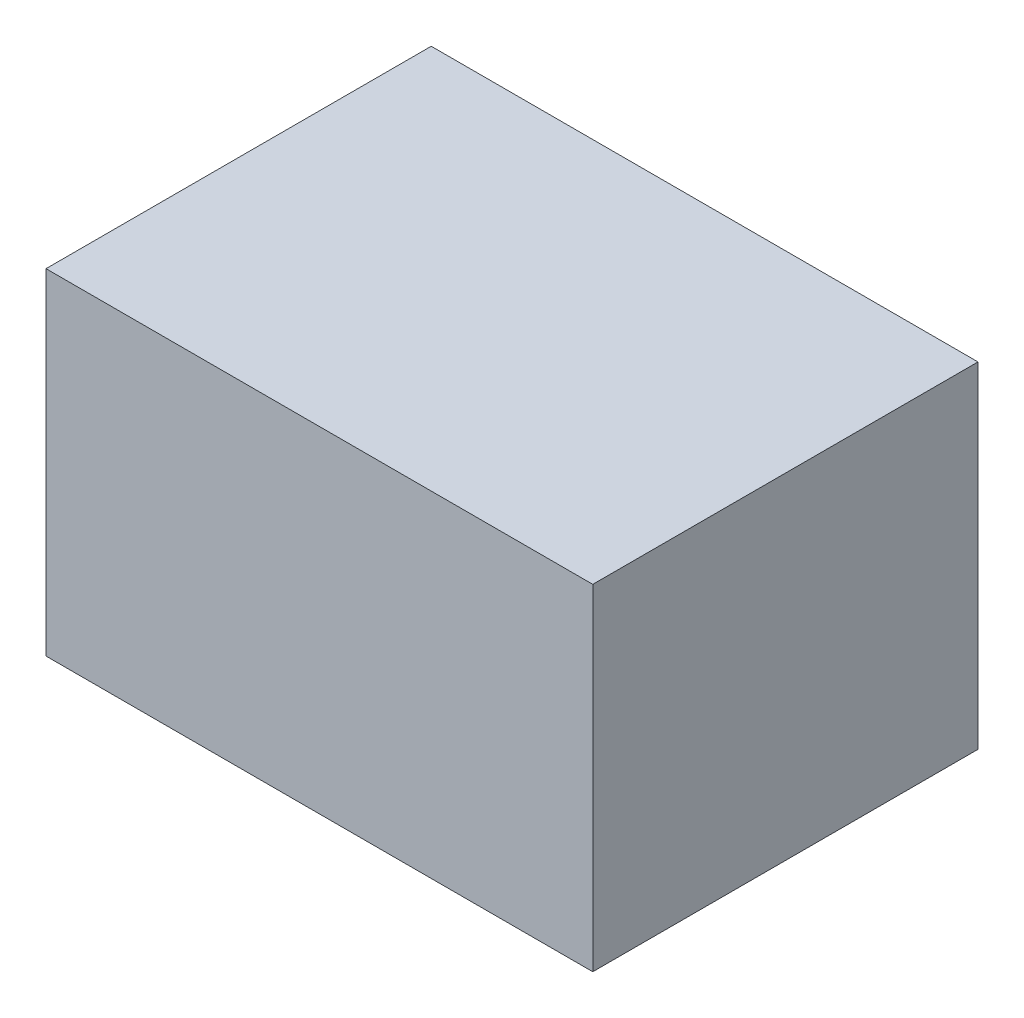
ISO-10303-21;
HEADER;
FILE_DESCRIPTION(('STEP AP214'),'2;1');
FILE_NAME('part.step','',(''),(''),'','','');
FILE_SCHEMA(('AUTOMOTIVE_DESIGN { 1 0 10303 214 1 1 1 1 }'));
ENDSEC;
DATA;
#1=APPLICATION_CONTEXT('core data for automotive mechanical design processes');
#2=APPLICATION_PROTOCOL_DEFINITION('international standard','automotive_design',2000,#1);
#3=PRODUCT_CONTEXT('',#1,'mechanical');
#4=PRODUCT('Part','Part','',(#3));
#5=PRODUCT_RELATED_PRODUCT_CATEGORY('part','',(#4));
#6=PRODUCT_DEFINITION_FORMATION('','',#4);
#7=PRODUCT_DEFINITION_CONTEXT('part definition',#1,'design');
#8=PRODUCT_DEFINITION('design','',#6,#7);
#9=PRODUCT_DEFINITION_SHAPE('','',#8);
#10=(LENGTH_UNIT() NAMED_UNIT(*) SI_UNIT(.MILLI.,.METRE.));
#11=(NAMED_UNIT(*) PLANE_ANGLE_UNIT() SI_UNIT($,.RADIAN.));
#12=(NAMED_UNIT(*) SI_UNIT($,.STERADIAN.) SOLID_ANGLE_UNIT());
#13=UNCERTAINTY_MEASURE_WITH_UNIT(LENGTH_MEASURE(1.E-05),#10,'distance_accuracy_value','');
#14=(GEOMETRIC_REPRESENTATION_CONTEXT(3) GLOBAL_UNCERTAINTY_ASSIGNED_CONTEXT((#13)) GLOBAL_UNIT_ASSIGNED_CONTEXT((#10,
#11,#12)) REPRESENTATION_CONTEXT('',''));
#15=CARTESIAN_POINT('',(0.,0.,0.));
#16=DIRECTION('',(0.,0.,1.));
#17=DIRECTION('',(1.,0.,0.));
#18=AXIS2_PLACEMENT_3D('',#15,#16,#17);
#19=CARTESIAN_POINT('',(11.,-6.75,15.5));
#20=DIRECTION('',(-1.,0.,0.));
#21=DIRECTION('',(0.,0.,1.));
#22=AXIS2_PLACEMENT_3D('',#19,#20,#21);
#23=PLANE('',#22);
#24=DIRECTION('',(0.,1.,0.));
#25=VECTOR('',#24,1.);
#26=CARTESIAN_POINT('',(11.,-6.75,0.));
#27=LINE('',#26,#25);
#28=CARTESIAN_POINT('',(11.,-6.75,0.));
#29=VERTEX_POINT('',#28);
#30=CARTESIAN_POINT('',(11.,6.75,0.));
#31=VERTEX_POINT('',#30);
#32=EDGE_CURVE('E102',#29,#31,#27,.T.);
#33=ORIENTED_EDGE('',*,*,#32,.T.);
#34=DIRECTION('',(0.,0.,-1.));
#35=VECTOR('',#34,1.);
#36=CARTESIAN_POINT('',(11.,6.75,15.5));
#37=LINE('',#36,#35);
#38=CARTESIAN_POINT('',(11.,6.75,15.5));
#39=VERTEX_POINT('',#38);
#40=EDGE_CURVE('E11',#39,#31,#37,.T.);
#41=ORIENTED_EDGE('',*,*,#40,.F.);
#42=DIRECTION('',(0.,1.,0.));
#43=VECTOR('',#42,1.);
#44=CARTESIAN_POINT('',(11.,-6.75,15.5));
#45=LINE('',#44,#43);
#46=CARTESIAN_POINT('',(11.,-6.75,15.5));
#47=VERTEX_POINT('',#46);
#48=EDGE_CURVE('E90',#47,#39,#45,.T.);
#49=ORIENTED_EDGE('',*,*,#48,.F.);
#50=DIRECTION('',(0.,0.,-1.));
#51=VECTOR('',#50,1.);
#52=CARTESIAN_POINT('',(11.,-6.75,15.5));
#53=LINE('',#52,#51);
#54=EDGE_CURVE('E98',#47,#29,#53,.T.);
#55=ORIENTED_EDGE('',*,*,#54,.T.);
#56=EDGE_LOOP('',(#33,#41,#49,#55));
#57=FACE_BOUND('',#56,.T.);
#58=ADVANCED_FACE('F39',(#57),#23,.F.);
#59=CARTESIAN_POINT('',(-11.,6.75,15.5));
#60=DIRECTION('',(0.,-1.,0.));
#61=DIRECTION('',(0.,0.,-1.));
#62=AXIS2_PLACEMENT_3D('',#59,#60,#61);
#63=PLANE('',#62);
#64=DIRECTION('',(-1.,0.,0.));
#65=VECTOR('',#64,1.);
#66=CARTESIAN_POINT('',(-11.,6.75,0.));
#67=LINE('',#66,#65);
#68=CARTESIAN_POINT('',(-11.,6.75,0.));
#69=VERTEX_POINT('',#68);
#70=EDGE_CURVE('E94',#31,#69,#67,.T.);
#71=ORIENTED_EDGE('',*,*,#70,.T.);
#72=DIRECTION('',(0.,0.,-1.));
#73=VECTOR('',#72,1.);
#74=CARTESIAN_POINT('',(-11.,6.75,15.5));
#75=LINE('',#74,#73);
#76=CARTESIAN_POINT('',(-11.,6.75,15.5));
#77=VERTEX_POINT('',#76);
#78=EDGE_CURVE('E47',#77,#69,#75,.T.);
#79=ORIENTED_EDGE('',*,*,#78,.F.);
#80=DIRECTION('',(-1.,0.,0.));
#81=VECTOR('',#80,1.);
#82=CARTESIAN_POINT('',(-11.,6.75,15.5));
#83=LINE('',#82,#81);
#84=EDGE_CURVE('E85',#39,#77,#83,.T.);
#85=ORIENTED_EDGE('',*,*,#84,.F.);
#86=ORIENTED_EDGE('',*,*,#40,.T.);
#87=EDGE_LOOP('',(#71,#79,#85,#86));
#88=FACE_BOUND('',#87,.T.);
#89=ADVANCED_FACE('F93',(#88),#63,.F.);
#90=CARTESIAN_POINT('',(-11.,-6.75,15.5));
#91=DIRECTION('',(1.,0.,0.));
#92=DIRECTION('',(0.,0.,-1.));
#93=AXIS2_PLACEMENT_3D('',#90,#91,#92);
#94=PLANE('',#93);
#95=DIRECTION('',(0.,-1.,0.));
#96=VECTOR('',#95,1.);
#97=CARTESIAN_POINT('',(-11.,-6.75,0.));
#98=LINE('',#97,#96);
#99=CARTESIAN_POINT('',(-11.,-6.75,0.));
#100=VERTEX_POINT('',#99);
#101=EDGE_CURVE('E72',#69,#100,#98,.T.);
#102=ORIENTED_EDGE('',*,*,#101,.T.);
#103=DIRECTION('',(0.,0.,-1.));
#104=VECTOR('',#103,1.);
#105=CARTESIAN_POINT('',(-11.,-6.75,15.5));
#106=LINE('',#105,#104);
#107=CARTESIAN_POINT('',(-11.,-6.75,15.5));
#108=VERTEX_POINT('',#107);
#109=EDGE_CURVE('E95',#108,#100,#106,.T.);
#110=ORIENTED_EDGE('',*,*,#109,.F.);
#111=DIRECTION('',(0.,-1.,0.));
#112=VECTOR('',#111,1.);
#113=CARTESIAN_POINT('',(-11.,-6.75,15.5));
#114=LINE('',#113,#112);
#115=EDGE_CURVE('E88',#77,#108,#114,.T.);
#116=ORIENTED_EDGE('',*,*,#115,.F.);
#117=ORIENTED_EDGE('',*,*,#78,.T.);
#118=EDGE_LOOP('',(#102,#110,#116,#117));
#119=FACE_BOUND('',#118,.T.);
#120=ADVANCED_FACE('F96',(#119),#94,.F.);
#121=CARTESIAN_POINT('',(-11.,-6.75,15.5));
#122=DIRECTION('',(0.,1.,0.));
#123=DIRECTION('',(0.,0.,1.));
#124=AXIS2_PLACEMENT_3D('',#121,#122,#123);
#125=PLANE('',#124);
#126=DIRECTION('',(1.,0.,0.));
#127=VECTOR('',#126,1.);
#128=CARTESIAN_POINT('',(-11.,-6.75,0.));
#129=LINE('',#128,#127);
#130=EDGE_CURVE('E78',#100,#29,#129,.T.);
#131=ORIENTED_EDGE('',*,*,#130,.T.);
#132=ORIENTED_EDGE('',*,*,#54,.F.);
#133=DIRECTION('',(1.,0.,0.));
#134=VECTOR('',#133,1.);
#135=CARTESIAN_POINT('',(-11.,-6.75,15.5));
#136=LINE('',#135,#134);
#137=EDGE_CURVE('E55',#108,#47,#136,.T.);
#138=ORIENTED_EDGE('',*,*,#137,.F.);
#139=ORIENTED_EDGE('',*,*,#109,.T.);
#140=EDGE_LOOP('',(#131,#132,#138,#139));
#141=FACE_BOUND('',#140,.T.);
#142=ADVANCED_FACE('F109',(#141),#125,.F.);
#143=CARTESIAN_POINT('',(0.,0.,15.5));
#144=DIRECTION('',(0.,0.,-1.));
#145=DIRECTION('',(-1.,0.,0.));
#146=AXIS2_PLACEMENT_3D('',#143,#144,#145);
#147=PLANE('',#146);
#148=ORIENTED_EDGE('',*,*,#48,.T.);
#149=ORIENTED_EDGE('',*,*,#84,.T.);
#150=ORIENTED_EDGE('',*,*,#115,.T.);
#151=ORIENTED_EDGE('',*,*,#137,.T.);
#152=EDGE_LOOP('',(#148,#149,#150,#151));
#153=FACE_BOUND('',#152,.T.);
#154=ADVANCED_FACE('F86',(#153),#147,.F.);
#155=CARTESIAN_POINT('',(0.,0.,0.));
#156=DIRECTION('',(0.,0.,-1.));
#157=DIRECTION('',(-1.,0.,0.));
#158=AXIS2_PLACEMENT_3D('',#155,#156,#157);
#159=PLANE('',#158);
#160=ORIENTED_EDGE('',*,*,#32,.F.);
#161=ORIENTED_EDGE('',*,*,#130,.F.);
#162=ORIENTED_EDGE('',*,*,#101,.F.);
#163=ORIENTED_EDGE('',*,*,#70,.F.);
#164=EDGE_LOOP('',(#160,#161,#162,#163));
#165=FACE_BOUND('',#164,.T.);
#166=ADVANCED_FACE('F112',(#165),#159,.T.);
#167=CLOSED_SHELL('',(#58,#89,#120,#142,#154,#166));
#168=MANIFOLD_SOLID_BREP('B2',#167);
#169=ADVANCED_BREP_SHAPE_REPRESENTATION('',(#18,#168),#14);
#170=SHAPE_DEFINITION_REPRESENTATION(#9,#169);
ENDSEC;
END-ISO-10303-21;
